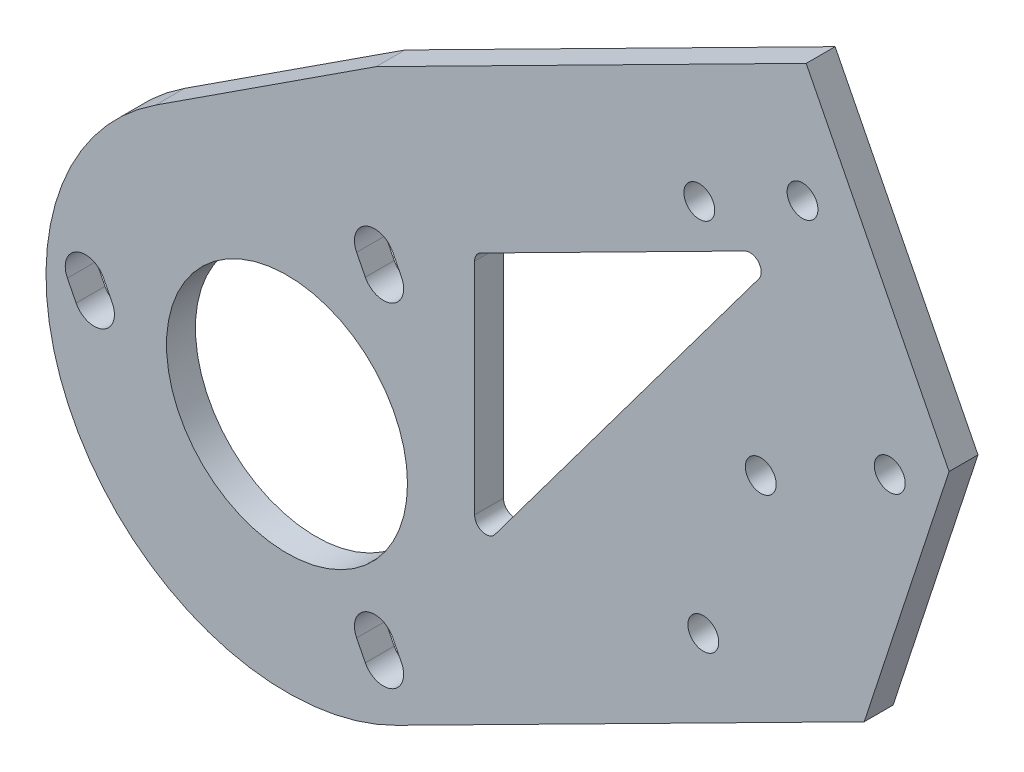
ISO-10303-21;
HEADER;
FILE_DESCRIPTION(('STEP AP214'),'2;1');
FILE_NAME('part.step','',(''),(''),'','','');
FILE_SCHEMA(('AUTOMOTIVE_DESIGN { 1 0 10303 214 1 1 1 1 }'));
ENDSEC;
DATA;
#1=APPLICATION_CONTEXT('core data for automotive mechanical design processes');
#2=APPLICATION_PROTOCOL_DEFINITION('international standard','automotive_design',2000,#1);
#3=PRODUCT_CONTEXT('',#1,'mechanical');
#4=PRODUCT('Part','Part','',(#3));
#5=PRODUCT_RELATED_PRODUCT_CATEGORY('part','',(#4));
#6=PRODUCT_DEFINITION_FORMATION('','',#4);
#7=PRODUCT_DEFINITION_CONTEXT('part definition',#1,'design');
#8=PRODUCT_DEFINITION('design','',#6,#7);
#9=PRODUCT_DEFINITION_SHAPE('','',#8);
#10=(LENGTH_UNIT() NAMED_UNIT(*) SI_UNIT(.MILLI.,.METRE.));
#11=(NAMED_UNIT(*) PLANE_ANGLE_UNIT() SI_UNIT($,.RADIAN.));
#12=(NAMED_UNIT(*) SI_UNIT($,.STERADIAN.) SOLID_ANGLE_UNIT());
#13=UNCERTAINTY_MEASURE_WITH_UNIT(LENGTH_MEASURE(1.E-05),#10,'distance_accuracy_value','');
#14=(GEOMETRIC_REPRESENTATION_CONTEXT(3) GLOBAL_UNCERTAINTY_ASSIGNED_CONTEXT((#13)) GLOBAL_UNIT_ASSIGNED_CONTEXT((#10,
#11,#12)) REPRESENTATION_CONTEXT('',''));
#15=CARTESIAN_POINT('',(0.,0.,0.));
#16=DIRECTION('',(0.,0.,1.));
#17=DIRECTION('',(1.,0.,0.));
#18=AXIS2_PLACEMENT_3D('',#15,#16,#17);
#19=CARTESIAN_POINT('',(-1.6306400674182E-13,-1.49186218934005E-12,3.));
#20=DIRECTION('',(0.,0.,1.));
#21=DIRECTION('',(1.,0.,0.));
#22=AXIS2_PLACEMENT_3D('',#19,#20,#21);
#23=PLANE('',#22);
#24=CARTESIAN_POINT('',(20.632958314391,0.684698738075619,3.));
#25=DIRECTION('',(0.,0.,1.));
#26=DIRECTION('',(-1.,0.,0.));
#27=AXIS2_PLACEMENT_3D('',#24,#25,#26);
#28=CIRCLE('',#27,1.17420210738263);
#29=CARTESIAN_POINT('',(19.4587562070083,0.684698738075619,3.));
#30=VERTEX_POINT('',#29);
#31=CARTESIAN_POINT('',(21.5737833891875,-0.0178671076754081,3.));
#32=VERTEX_POINT('',#31);
#33=EDGE_CURVE('E62',#30,#32,#28,.T.);
#34=ORIENTED_EDGE('',*,*,#33,.F.);
#35=DIRECTION('',(0.,-1.,0.));
#36=VECTOR('',#35,1.);
#37=CARTESIAN_POINT('',(19.4587562070083,0.684698738075619,3.));
#38=LINE('',#37,#36);
#39=CARTESIAN_POINT('',(19.4587562070083,23.484968490289,3.));
#40=VERTEX_POINT('',#39);
#41=EDGE_CURVE('E226',#40,#30,#38,.T.);
#42=ORIENTED_EDGE('',*,*,#41,.F.);
#43=CARTESIAN_POINT('',(20.632958314391,23.484968490289,3.));
#44=DIRECTION('',(0.,0.,1.));
#45=DIRECTION('',(1.,0.,0.));
#46=AXIS2_PLACEMENT_3D('',#43,#44,#45);
#47=CIRCLE('',#46,1.17420210738264);
#48=CARTESIAN_POINT('',(20.1023229816226,24.5324305338016,3.));
#49=VERTEX_POINT('',#48);
#50=EDGE_CURVE('E229',#49,#40,#47,.T.);
#51=ORIENTED_EDGE('',*,*,#50,.F.);
#52=DIRECTION('',(-0.892062820298879,-0.451911412381243,0.));
#53=VECTOR('',#52,1.);
#54=CARTESIAN_POINT('',(20.1023229816226,24.5324305338016,3.));
#55=LINE('',#54,#53);
#56=CARTESIAN_POINT('',(47.4888569635311,38.4062149471511,3.));
#57=VERTEX_POINT('',#56);
#58=EDGE_CURVE('E245',#57,#49,#55,.T.);
#59=ORIENTED_EDGE('',*,*,#58,.F.);
#60=CARTESIAN_POINT('',(48.0194922962994,37.3587529036385,3.));
#61=DIRECTION('',(0.,0.,1.));
#62=DIRECTION('',(-1.,0.,0.));
#63=AXIS2_PLACEMENT_3D('',#60,#61,#62);
#64=CIRCLE('',#63,1.17420210738263);
#65=CARTESIAN_POINT('',(48.9603173710959,36.6561870578874,3.));
#66=VERTEX_POINT('',#65);
#67=EDGE_CURVE('E242',#66,#57,#64,.T.);
#68=ORIENTED_EDGE('',*,*,#67,.F.);
#69=DIRECTION('',(0.598334683044547,0.8012462836519,0.));
#70=VECTOR('',#69,1.);
#71=CARTESIAN_POINT('',(48.9603173710959,36.6561870578874,3.));
#72=LINE('',#71,#70);
#73=EDGE_CURVE('E240',#32,#66,#72,.T.);
#74=ORIENTED_EDGE('',*,*,#73,.F.);
#75=EDGE_LOOP('',(#34,#42,#51,#59,#68,#74));
#76=FACE_BOUND('',#75,.T.);
#77=CARTESIAN_POINT('',(62.5262645189243,25.8460861556181,3.));
#78=DIRECTION('',(0.,0.,1.));
#79=DIRECTION('',(1.,0.,0.));
#80=AXIS2_PLACEMENT_3D('',#77,#78,#79);
#81=CIRCLE('',#80,1.59999999999979);
#82=CARTESIAN_POINT('',(64.1262645189241,25.8460861556181,3.));
#83=VERTEX_POINT('',#82);
#84=EDGE_CURVE('E264',#83,#83,#81,.T.);
#85=ORIENTED_EDGE('',*,*,#84,.F.);
#86=EDGE_LOOP('',(#85));
#87=FACE_BOUND('',#86,.T.);
#88=CARTESIAN_POINT('',(49.1453222144412,19.0674149698994,3.));
#89=DIRECTION('',(0.,0.,1.));
#90=DIRECTION('',(1.,0.,0.));
#91=AXIS2_PLACEMENT_3D('',#88,#89,#90);
#92=CIRCLE('',#91,1.59999999999967);
#93=CARTESIAN_POINT('',(50.7453222144408,19.0674149698994,3.));
#94=VERTEX_POINT('',#93);
#95=EDGE_CURVE('E270',#94,#94,#92,.T.);
#96=ORIENTED_EDGE('',*,*,#95,.F.);
#97=EDGE_LOOP('',(#96));
#98=FACE_BOUND('',#97,.T.);
#99=CARTESIAN_POINT('',(43.1880414885324,1.89930551405371,3.));
#100=DIRECTION('',(0.,0.,1.));
#101=DIRECTION('',(1.,0.,0.));
#102=AXIS2_PLACEMENT_3D('',#99,#100,#101);
#103=CIRCLE('',#102,1.6);
#104=CARTESIAN_POINT('',(44.7880414885324,1.89930551405371,3.));
#105=VERTEX_POINT('',#104);
#106=EDGE_CURVE('E252',#105,#105,#103,.T.);
#107=ORIENTED_EDGE('',*,*,#106,.F.);
#108=EDGE_LOOP('',(#107));
#109=FACE_BOUND('',#108,.T.);
#110=CARTESIAN_POINT('',(53.4762762668347,45.9233796145766,3.));
#111=DIRECTION('',(0.,0.,1.));
#112=DIRECTION('',(1.,0.,0.));
#113=AXIS2_PLACEMENT_3D('',#110,#111,#112);
#114=CIRCLE('',#113,1.60000000000032);
#115=CARTESIAN_POINT('',(55.076276266835,45.9233796145766,3.));
#116=VERTEX_POINT('',#115);
#117=EDGE_CURVE('E284',#116,#116,#114,.T.);
#118=ORIENTED_EDGE('',*,*,#117,.F.);
#119=EDGE_LOOP('',(#118));
#120=FACE_BOUND('',#119,.T.);
#121=DIRECTION('',(0.892062820298877,0.451911412381248,0.));
#122=VECTOR('',#121,1.);
#123=CARTESIAN_POINT('',(11.297785309531,-22.3015705074734,3.));
#124=LINE('',#123,#122);
#125=CARTESIAN_POINT('',(11.297785309531,-22.3015705074734,3.));
#126=VERTEX_POINT('',#125);
#127=CARTESIAN_POINT('',(59.8772938201872,2.30839395274492,3.));
#128=VERTEX_POINT('',#127);
#129=EDGE_CURVE('E397',#126,#128,#124,.T.);
#130=ORIENTED_EDGE('',*,*,#129,.T.);
#131=DIRECTION('',(-0.311234045287363,-0.950333293668102,0.));
#132=VECTOR('',#131,1.);
#133=CARTESIAN_POINT('',(53.3944143939385,-17.4866646241909,3.));
#134=LINE('',#133,#132);
#135=CARTESIAN_POINT('',(68.6803219785398,29.1878786063474,3.));
#136=VERTEX_POINT('',#135);
#137=EDGE_CURVE('E13',#128,#136,#134,.F.);
#138=ORIENTED_EDGE('',*,*,#137,.T.);
#139=DIRECTION('',(-0.451911412381248,0.892062820298876,0.));
#140=VECTOR('',#139,1.);
#141=CARTESIAN_POINT('',(77.7185502261648,11.3466222003699,3.));
#142=LINE('',#141,#140);
#143=CARTESIAN_POINT('',(53.8576276524343,58.4475391121517,3.));
#144=VERTEX_POINT('',#143);
#145=EDGE_CURVE('E400',#136,#144,#142,.T.);
#146=ORIENTED_EDGE('',*,*,#145,.T.);
#147=DIRECTION('',(-0.892062820298879,-0.451911412381243,0.));
#148=VECTOR('',#147,1.);
#149=CARTESIAN_POINT('',(53.8576276524343,58.4475391121517,3.));
#150=LINE('',#149,#148);
#151=CARTESIAN_POINT('',(9.25448663749034,35.8519684930896,3.));
#152=VERTEX_POINT('',#151);
#153=EDGE_CURVE('E389',#144,#152,#150,.T.);
#154=ORIENTED_EDGE('',*,*,#153,.T.);
#155=DIRECTION('',(-0.838118804228008,-0.545487735883597,0.));
#156=VECTOR('',#155,1.);
#157=CARTESIAN_POINT('',(-13.6371933970901,20.9529701056987,3.));
#158=LINE('',#157,#156);
#159=CARTESIAN_POINT('',(-13.6371933970901,20.9529701056987,3.));
#160=VERTEX_POINT('',#159);
#161=EDGE_CURVE('E392',#152,#160,#158,.T.);
#162=ORIENTED_EDGE('',*,*,#161,.T.);
#163=CARTESIAN_POINT('',(-1.6306400674182E-13,-1.49186218934005E-12,3.));
#164=DIRECTION('',(0.,0.,1.));
#165=DIRECTION('',(1.,0.,0.));
#166=AXIS2_PLACEMENT_3D('',#163,#164,#165);
#167=CIRCLE('',#166,25.);
#168=EDGE_CURVE('E395',#160,#126,#167,.T.);
#169=ORIENTED_EDGE('',*,*,#168,.T.);
#170=EDGE_LOOP('',(#130,#138,#146,#154,#162,#169));
#171=FACE_BOUND('',#170,.T.);
#172=CARTESIAN_POINT('',(-1.6306400674182E-13,-1.49186218934005E-12,3.));
#173=DIRECTION('',(0.,0.,1.));
#174=DIRECTION('',(1.,0.,0.));
#175=AXIS2_PLACEMENT_3D('',#172,#173,#174);
#176=CIRCLE('',#175,12.5);
#177=CARTESIAN_POINT('',(12.4999999999998,-1.49186218934005E-12,3.));
#178=VERTEX_POINT('',#177);
#179=EDGE_CURVE('E383',#178,#178,#176,.T.);
#180=ORIENTED_EDGE('',*,*,#179,.F.);
#181=EDGE_LOOP('',(#180));
#182=FACE_BOUND('',#181,.T.);
#183=DIRECTION('',(-0.451911412381246,0.892062820298877,0.));
#184=VECTOR('',#183,1.);
#185=CARTESIAN_POINT('',(11.8733319226275,18.2695220416649,3.));
#186=LINE('',#185,#184);
#187=CARTESIAN_POINT('',(11.8733319226275,18.2695220416649,3.));
#188=VERTEX_POINT('',#187);
#189=CARTESIAN_POINT('',(10.969509097865,20.0536476822627,3.));
#190=VERTEX_POINT('',#189);
#191=EDGE_CURVE('E354',#188,#190,#186,.T.);
#192=ORIENTED_EDGE('',*,*,#191,.F.);
#193=CARTESIAN_POINT('',(9.99999999999988,17.3205080756643,3.));
#194=DIRECTION('',(0.,0.,1.));
#195=DIRECTION('',(1.,0.,0.));
#196=AXIS2_PLACEMENT_3D('',#193,#194,#195);
#197=CIRCLE('',#196,2.1);
#198=CARTESIAN_POINT('',(8.12666807737224,16.3714941096637,3.));
#199=VERTEX_POINT('',#198);
#200=EDGE_CURVE('E352',#199,#188,#197,.T.);
#201=ORIENTED_EDGE('',*,*,#200,.F.);
#202=DIRECTION('',(0.451911412381248,-0.892062820298877,0.));
#203=VECTOR('',#202,1.);
#204=CARTESIAN_POINT('',(8.12666807737224,16.3714941096637,3.));
#205=LINE('',#204,#203);
#206=CARTESIAN_POINT('',(7.22284525260974,18.1556197502614,3.));
#207=VERTEX_POINT('',#206);
#208=EDGE_CURVE('E360',#207,#199,#205,.T.);
#209=ORIENTED_EDGE('',*,*,#208,.F.);
#210=CARTESIAN_POINT('',(9.09617717523739,19.1046337162621,3.));
#211=DIRECTION('',(0.,0.,1.));
#212=DIRECTION('',(1.,0.,0.));
#213=AXIS2_PLACEMENT_3D('',#210,#211,#212);
#214=CIRCLE('',#213,2.1);
#215=EDGE_CURVE('E357',#190,#207,#214,.T.);
#216=ORIENTED_EDGE('',*,*,#215,.F.);
#217=EDGE_LOOP('',(#192,#201,#209,#216));
#218=FACE_BOUND('',#217,.T.);
#219=DIRECTION('',(-0.451911412381243,0.892062820298879,0.));
#220=VECTOR('',#219,1.);
#221=CARTESIAN_POINT('',(-18.1266680773724,0.949013965976172,3.));
#222=LINE('',#221,#220);
#223=CARTESIAN_POINT('',(-18.1266680773724,0.949013965976172,3.));
#224=VERTEX_POINT('',#223);
#225=CARTESIAN_POINT('',(-19.0304909021349,2.73313960657392,3.));
#226=VERTEX_POINT('',#225);
#227=EDGE_CURVE('E323',#224,#226,#222,.T.);
#228=ORIENTED_EDGE('',*,*,#227,.F.);
#229=CARTESIAN_POINT('',(-20.,-2.44396516912992E-11,3.));
#230=DIRECTION('',(0.,0.,1.));
#231=DIRECTION('',(1.,0.,0.));
#232=AXIS2_PLACEMENT_3D('',#229,#230,#231);
#233=CIRCLE('',#232,2.1);
#234=CARTESIAN_POINT('',(-21.8733319226276,-0.949013966025059,3.));
#235=VERTEX_POINT('',#234);
#236=EDGE_CURVE('E321',#235,#224,#233,.T.);
#237=ORIENTED_EDGE('',*,*,#236,.F.);
#238=DIRECTION('',(0.451911412381248,-0.892062820298876,0.));
#239=VECTOR('',#238,1.);
#240=CARTESIAN_POINT('',(-21.8733319226276,-0.949013966025059,3.));
#241=LINE('',#240,#239);
#242=CARTESIAN_POINT('',(-22.7771547473901,0.835111674572692,3.));
#243=VERTEX_POINT('',#242);
#244=EDGE_CURVE('E329',#243,#235,#241,.T.);
#245=ORIENTED_EDGE('',*,*,#244,.F.);
#246=CARTESIAN_POINT('',(-20.9038228247625,1.78412564057331,3.));
#247=DIRECTION('',(0.,0.,1.));
#248=DIRECTION('',(1.,0.,0.));
#249=AXIS2_PLACEMENT_3D('',#246,#247,#248);
#250=CIRCLE('',#249,2.1);
#251=EDGE_CURVE('E326',#226,#243,#250,.T.);
#252=ORIENTED_EDGE('',*,*,#251,.F.);
#253=EDGE_LOOP('',(#228,#237,#245,#252));
#254=FACE_BOUND('',#253,.T.);
#255=DIRECTION('',(-0.451911412381243,0.892062820298879,0.));
#256=VECTOR('',#255,1.);
#257=CARTESIAN_POINT('',(11.8733319226276,-16.3714941097127,3.));
#258=LINE('',#257,#256);
#259=CARTESIAN_POINT('',(11.8733319226276,-16.3714941097127,3.));
#260=VERTEX_POINT('',#259);
#261=CARTESIAN_POINT('',(10.9695090978652,-14.5873684691149,3.));
#262=VERTEX_POINT('',#261);
#263=EDGE_CURVE('E292',#260,#262,#258,.T.);
#264=ORIENTED_EDGE('',*,*,#263,.F.);
#265=CARTESIAN_POINT('',(9.99999999999999,-17.3205080757133,3.));
#266=DIRECTION('',(0.,0.,1.));
#267=DIRECTION('',(1.,0.,0.));
#268=AXIS2_PLACEMENT_3D('',#265,#266,#267);
#269=CIRCLE('',#268,2.1);
#270=CARTESIAN_POINT('',(8.12666807737235,-18.2695220417139,3.));
#271=VERTEX_POINT('',#270);
#272=EDGE_CURVE('E290',#271,#260,#269,.T.);
#273=ORIENTED_EDGE('',*,*,#272,.F.);
#274=DIRECTION('',(0.451911412381249,-0.892062820298876,0.));
#275=VECTOR('',#274,1.);
#276=CARTESIAN_POINT('',(8.12666807737235,-18.2695220417139,3.));
#277=LINE('',#276,#275);
#278=CARTESIAN_POINT('',(7.22284525260986,-16.4853964011162,3.));
#279=VERTEX_POINT('',#278);
#280=EDGE_CURVE('E298',#279,#271,#277,.T.);
#281=ORIENTED_EDGE('',*,*,#280,.F.);
#282=CARTESIAN_POINT('',(9.0961771752375,-15.5363824351155,3.));
#283=DIRECTION('',(0.,0.,1.));
#284=DIRECTION('',(1.,0.,0.));
#285=AXIS2_PLACEMENT_3D('',#282,#283,#284);
#286=CIRCLE('',#285,2.10000000000001);
#287=EDGE_CURVE('E295',#262,#279,#286,.T.);
#288=ORIENTED_EDGE('',*,*,#287,.F.);
#289=EDGE_LOOP('',(#264,#273,#281,#288));
#290=FACE_BOUND('',#289,.T.);
#291=CARTESIAN_POINT('',(42.7715224232482,40.5004426660017,3.));
#292=DIRECTION('',(0.,0.,1.));
#293=DIRECTION('',(1.,0.,0.));
#294=AXIS2_PLACEMENT_3D('',#291,#292,#293);
#295=CIRCLE('',#294,1.60000000000021);
#296=CARTESIAN_POINT('',(44.3715224232484,40.5004426660017,3.));
#297=VERTEX_POINT('',#296);
#298=EDGE_CURVE('E278',#297,#297,#295,.T.);
#299=ORIENTED_EDGE('',*,*,#298,.F.);
#300=EDGE_LOOP('',(#299));
#301=FACE_BOUND('',#300,.T.);
#302=ADVANCED_FACE('F47',(#76,#87,#98,#109,#120,#171,#182,#218,#254,#290,#301),#23,.T.);
#303=CARTESIAN_POINT('',(-1.6306400674182E-13,-1.49186218934005E-12,0.));
#304=DIRECTION('',(0.,0.,1.));
#305=DIRECTION('',(1.,0.,0.));
#306=AXIS2_PLACEMENT_3D('',#303,#304,#305);
#307=PLANE('',#306);
#308=DIRECTION('',(0.,-1.,0.));
#309=VECTOR('',#308,1.);
#310=CARTESIAN_POINT('',(19.4587562070083,0.684698738075619,0.));
#311=LINE('',#310,#309);
#312=CARTESIAN_POINT('',(19.4587562070083,23.484968490289,0.));
#313=VERTEX_POINT('',#312);
#314=CARTESIAN_POINT('',(19.4587562070083,0.684698738075619,0.));
#315=VERTEX_POINT('',#314);
#316=EDGE_CURVE('E215',#313,#315,#311,.T.);
#317=ORIENTED_EDGE('',*,*,#316,.T.);
#318=CARTESIAN_POINT('',(20.632958314391,0.684698738075619,0.));
#319=DIRECTION('',(0.,0.,1.));
#320=DIRECTION('',(-1.,0.,0.));
#321=AXIS2_PLACEMENT_3D('',#318,#319,#320);
#322=CIRCLE('',#321,1.17420210738263);
#323=CARTESIAN_POINT('',(21.5737833891875,-0.0178671076754102,0.));
#324=VERTEX_POINT('',#323);
#325=EDGE_CURVE('E209',#315,#324,#322,.T.);
#326=ORIENTED_EDGE('',*,*,#325,.T.);
#327=DIRECTION('',(0.598334683044547,0.8012462836519,0.));
#328=VECTOR('',#327,1.);
#329=CARTESIAN_POINT('',(48.9603173710959,36.6561870578874,0.));
#330=LINE('',#329,#328);
#331=CARTESIAN_POINT('',(48.9603173710959,36.6561870578874,0.));
#332=VERTEX_POINT('',#331);
#333=EDGE_CURVE('E218',#324,#332,#330,.T.);
#334=ORIENTED_EDGE('',*,*,#333,.T.);
#335=CARTESIAN_POINT('',(48.0194922962994,37.3587529036385,0.));
#336=DIRECTION('',(0.,0.,1.));
#337=DIRECTION('',(-1.,0.,0.));
#338=AXIS2_PLACEMENT_3D('',#335,#336,#337);
#339=CIRCLE('',#338,1.17420210738263);
#340=CARTESIAN_POINT('',(47.4888569635311,38.4062149471511,0.));
#341=VERTEX_POINT('',#340);
#342=EDGE_CURVE('E70',#332,#341,#339,.T.);
#343=ORIENTED_EDGE('',*,*,#342,.T.);
#344=DIRECTION('',(-0.892062820298879,-0.451911412381243,0.));
#345=VECTOR('',#344,1.);
#346=CARTESIAN_POINT('',(20.1023229816226,24.5324305338016,0.));
#347=LINE('',#346,#345);
#348=CARTESIAN_POINT('',(20.1023229816226,24.5324305338016,0.));
#349=VERTEX_POINT('',#348);
#350=EDGE_CURVE('E233',#341,#349,#347,.T.);
#351=ORIENTED_EDGE('',*,*,#350,.T.);
#352=CARTESIAN_POINT('',(20.632958314391,23.484968490289,0.));
#353=DIRECTION('',(0.,0.,1.));
#354=DIRECTION('',(1.,0.,0.));
#355=AXIS2_PLACEMENT_3D('',#352,#353,#354);
#356=CIRCLE('',#355,1.17420210738264);
#357=EDGE_CURVE('E236',#349,#313,#356,.T.);
#358=ORIENTED_EDGE('',*,*,#357,.T.);
#359=EDGE_LOOP('',(#317,#326,#334,#343,#351,#358));
#360=FACE_BOUND('',#359,.T.);
#361=CARTESIAN_POINT('',(62.5262645189243,25.8460861556181,0.));
#362=DIRECTION('',(0.,0.,1.));
#363=DIRECTION('',(1.,0.,0.));
#364=AXIS2_PLACEMENT_3D('',#361,#362,#363);
#365=CIRCLE('',#364,1.59999999999979);
#366=CARTESIAN_POINT('',(64.1262645189241,25.8460861556181,0.));
#367=VERTEX_POINT('',#366);
#368=EDGE_CURVE('E260',#367,#367,#365,.T.);
#369=ORIENTED_EDGE('',*,*,#368,.T.);
#370=EDGE_LOOP('',(#369));
#371=FACE_BOUND('',#370,.T.);
#372=CARTESIAN_POINT('',(49.1453222144412,19.0674149698994,0.));
#373=DIRECTION('',(0.,0.,1.));
#374=DIRECTION('',(1.,0.,0.));
#375=AXIS2_PLACEMENT_3D('',#372,#373,#374);
#376=CIRCLE('',#375,1.59999999999967);
#377=CARTESIAN_POINT('',(50.7453222144408,19.0674149698994,0.));
#378=VERTEX_POINT('',#377);
#379=EDGE_CURVE('E267',#378,#378,#376,.T.);
#380=ORIENTED_EDGE('',*,*,#379,.T.);
#381=EDGE_LOOP('',(#380));
#382=FACE_BOUND('',#381,.T.);
#383=CARTESIAN_POINT('',(43.1880414885324,1.89930551405371,0.));
#384=DIRECTION('',(0.,0.,1.));
#385=DIRECTION('',(1.,0.,0.));
#386=AXIS2_PLACEMENT_3D('',#383,#384,#385);
#387=CIRCLE('',#386,1.6);
#388=CARTESIAN_POINT('',(44.7880414885324,1.89930551405371,0.));
#389=VERTEX_POINT('',#388);
#390=EDGE_CURVE('E273',#389,#389,#387,.T.);
#391=ORIENTED_EDGE('',*,*,#390,.T.);
#392=EDGE_LOOP('',(#391));
#393=FACE_BOUND('',#392,.T.);
#394=CARTESIAN_POINT('',(-20.,-2.44396516912992E-11,0.));
#395=DIRECTION('',(0.,0.,1.));
#396=DIRECTION('',(1.,0.,0.));
#397=AXIS2_PLACEMENT_3D('',#394,#395,#396);
#398=CIRCLE('',#397,2.1);
#399=CARTESIAN_POINT('',(-21.8733319226276,-0.949013966025059,0.));
#400=VERTEX_POINT('',#399);
#401=CARTESIAN_POINT('',(-18.1266680773724,0.949013965976172,0.));
#402=VERTEX_POINT('',#401);
#403=EDGE_CURVE('E320',#400,#402,#398,.T.);
#404=ORIENTED_EDGE('',*,*,#403,.T.);
#405=DIRECTION('',(-0.451911412381243,0.892062820298879,0.));
#406=VECTOR('',#405,1.);
#407=CARTESIAN_POINT('',(-18.1266680773724,0.949013965976172,0.));
#408=LINE('',#407,#406);
#409=CARTESIAN_POINT('',(-19.0304909021349,2.73313960657392,0.));
#410=VERTEX_POINT('',#409);
#411=EDGE_CURVE('E334',#402,#410,#408,.T.);
#412=ORIENTED_EDGE('',*,*,#411,.T.);
#413=CARTESIAN_POINT('',(-20.9038228247625,1.78412564057331,0.));
#414=DIRECTION('',(0.,0.,1.));
#415=DIRECTION('',(1.,0.,0.));
#416=AXIS2_PLACEMENT_3D('',#413,#414,#415);
#417=CIRCLE('',#416,2.1);
#418=CARTESIAN_POINT('',(-22.7771547473901,0.835111674572693,0.));
#419=VERTEX_POINT('',#418);
#420=EDGE_CURVE('E337',#410,#419,#417,.T.);
#421=ORIENTED_EDGE('',*,*,#420,.T.);
#422=DIRECTION('',(0.451911412381248,-0.892062820298876,0.));
#423=VECTOR('',#422,1.);
#424=CARTESIAN_POINT('',(-21.8733319226276,-0.949013966025059,0.));
#425=LINE('',#424,#423);
#426=EDGE_CURVE('E324',#419,#400,#425,.T.);
#427=ORIENTED_EDGE('',*,*,#426,.T.);
#428=EDGE_LOOP('',(#404,#412,#421,#427));
#429=FACE_BOUND('',#428,.T.);
#430=CARTESIAN_POINT('',(-1.6306400674182E-13,-1.49186218934005E-12,0.));
#431=DIRECTION('',(0.,0.,1.));
#432=DIRECTION('',(1.,0.,0.));
#433=AXIS2_PLACEMENT_3D('',#430,#431,#432);
#434=CIRCLE('',#433,12.5);
#435=CARTESIAN_POINT('',(12.4999999999998,-1.49186218934005E-12,0.));
#436=VERTEX_POINT('',#435);
#437=EDGE_CURVE('E382',#436,#436,#434,.T.);
#438=ORIENTED_EDGE('',*,*,#437,.T.);
#439=EDGE_LOOP('',(#438));
#440=FACE_BOUND('',#439,.T.);
#441=DIRECTION('',(-0.451911412381248,0.892062820298876,0.));
#442=VECTOR('',#441,1.);
#443=CARTESIAN_POINT('',(77.7185502261648,11.3466222003699,0.));
#444=LINE('',#443,#442);
#445=CARTESIAN_POINT('',(68.6803219785398,29.1878786063474,0.));
#446=VERTEX_POINT('',#445);
#447=CARTESIAN_POINT('',(53.8576276524343,58.4475391121517,0.));
#448=VERTEX_POINT('',#447);
#449=EDGE_CURVE('E393',#446,#448,#444,.T.);
#450=ORIENTED_EDGE('',*,*,#449,.F.);
#451=DIRECTION('',(0.311234045287363,0.950333293668102,0.));
#452=VECTOR('',#451,1.);
#453=CARTESIAN_POINT('',(68.6803219785398,29.1878786063474,0.));
#454=LINE('',#453,#452);
#455=CARTESIAN_POINT('',(59.8772938201872,2.30839395274492,0.));
#456=VERTEX_POINT('',#455);
#457=EDGE_CURVE('E427',#446,#456,#454,.F.);
#458=ORIENTED_EDGE('',*,*,#457,.T.);
#459=DIRECTION('',(0.892062820298877,0.451911412381248,0.));
#460=VECTOR('',#459,1.);
#461=CARTESIAN_POINT('',(11.297785309531,-22.3015705074734,0.));
#462=LINE('',#461,#460);
#463=CARTESIAN_POINT('',(11.297785309531,-22.3015705074734,0.));
#464=VERTEX_POINT('',#463);
#465=EDGE_CURVE('E409',#464,#456,#462,.T.);
#466=ORIENTED_EDGE('',*,*,#465,.F.);
#467=CARTESIAN_POINT('',(-1.6306400674182E-13,-1.49186218934005E-12,0.));
#468=DIRECTION('',(0.,0.,1.));
#469=DIRECTION('',(1.,0.,0.));
#470=AXIS2_PLACEMENT_3D('',#467,#468,#469);
#471=CIRCLE('',#470,25.);
#472=CARTESIAN_POINT('',(-13.6371933970901,20.9529701056987,0.));
#473=VERTEX_POINT('',#472);
#474=EDGE_CURVE('E407',#473,#464,#471,.T.);
#475=ORIENTED_EDGE('',*,*,#474,.F.);
#476=DIRECTION('',(-0.838118804228008,-0.545487735883597,0.));
#477=VECTOR('',#476,1.);
#478=CARTESIAN_POINT('',(-13.6371933970901,20.9529701056987,0.));
#479=LINE('',#478,#477);
#480=CARTESIAN_POINT('',(9.25448663749034,35.8519684930896,0.));
#481=VERTEX_POINT('',#480);
#482=EDGE_CURVE('E405',#481,#473,#479,.T.);
#483=ORIENTED_EDGE('',*,*,#482,.F.);
#484=DIRECTION('',(-0.892062820298879,-0.451911412381243,0.));
#485=VECTOR('',#484,1.);
#486=CARTESIAN_POINT('',(53.8576276524343,58.4475391121517,0.));
#487=LINE('',#486,#485);
#488=EDGE_CURVE('E386',#448,#481,#487,.T.);
#489=ORIENTED_EDGE('',*,*,#488,.F.);
#490=EDGE_LOOP('',(#450,#458,#466,#475,#483,#489));
#491=FACE_BOUND('',#490,.T.);
#492=CARTESIAN_POINT('',(9.99999999999988,17.3205080756643,0.));
#493=DIRECTION('',(0.,0.,1.));
#494=DIRECTION('',(1.,0.,0.));
#495=AXIS2_PLACEMENT_3D('',#492,#493,#494);
#496=CIRCLE('',#495,2.1);
#497=CARTESIAN_POINT('',(8.12666807737224,16.3714941096637,0.));
#498=VERTEX_POINT('',#497);
#499=CARTESIAN_POINT('',(11.8733319226275,18.2695220416649,0.));
#500=VERTEX_POINT('',#499);
#501=EDGE_CURVE('E351',#498,#500,#496,.T.);
#502=ORIENTED_EDGE('',*,*,#501,.T.);
#503=DIRECTION('',(-0.451911412381246,0.892062820298877,0.));
#504=VECTOR('',#503,1.);
#505=CARTESIAN_POINT('',(11.8733319226275,18.2695220416649,0.));
#506=LINE('',#505,#504);
#507=CARTESIAN_POINT('',(10.969509097865,20.0536476822627,0.));
#508=VERTEX_POINT('',#507);
#509=EDGE_CURVE('E365',#500,#508,#506,.T.);
#510=ORIENTED_EDGE('',*,*,#509,.T.);
#511=CARTESIAN_POINT('',(9.09617717523739,19.1046337162621,0.));
#512=DIRECTION('',(0.,0.,1.));
#513=DIRECTION('',(1.,0.,0.));
#514=AXIS2_PLACEMENT_3D('',#511,#512,#513);
#515=CIRCLE('',#514,2.1);
#516=CARTESIAN_POINT('',(7.22284525260974,18.1556197502614,0.));
#517=VERTEX_POINT('',#516);
#518=EDGE_CURVE('E368',#508,#517,#515,.T.);
#519=ORIENTED_EDGE('',*,*,#518,.T.);
#520=DIRECTION('',(0.451911412381248,-0.892062820298877,0.));
#521=VECTOR('',#520,1.);
#522=CARTESIAN_POINT('',(8.12666807737224,16.3714941096637,0.));
#523=LINE('',#522,#521);
#524=EDGE_CURVE('E355',#517,#498,#523,.T.);
#525=ORIENTED_EDGE('',*,*,#524,.T.);
#526=EDGE_LOOP('',(#502,#510,#519,#525));
#527=FACE_BOUND('',#526,.T.);
#528=CARTESIAN_POINT('',(9.99999999999999,-17.3205080757133,0.));
#529=DIRECTION('',(0.,0.,1.));
#530=DIRECTION('',(1.,0.,0.));
#531=AXIS2_PLACEMENT_3D('',#528,#529,#530);
#532=CIRCLE('',#531,2.1);
#533=CARTESIAN_POINT('',(8.12666807737235,-18.2695220417139,0.));
#534=VERTEX_POINT('',#533);
#535=CARTESIAN_POINT('',(11.8733319226276,-16.3714941097127,0.));
#536=VERTEX_POINT('',#535);
#537=EDGE_CURVE('E287',#534,#536,#532,.T.);
#538=ORIENTED_EDGE('',*,*,#537,.T.);
#539=DIRECTION('',(-0.451911412381243,0.892062820298879,0.));
#540=VECTOR('',#539,1.);
#541=CARTESIAN_POINT('',(11.8733319226276,-16.3714941097127,0.));
#542=LINE('',#541,#540);
#543=CARTESIAN_POINT('',(10.9695090978652,-14.5873684691149,0.));
#544=VERTEX_POINT('',#543);
#545=EDGE_CURVE('E303',#536,#544,#542,.T.);
#546=ORIENTED_EDGE('',*,*,#545,.T.);
#547=CARTESIAN_POINT('',(9.0961771752375,-15.5363824351155,0.));
#548=DIRECTION('',(0.,0.,1.));
#549=DIRECTION('',(1.,0.,0.));
#550=AXIS2_PLACEMENT_3D('',#547,#548,#549);
#551=CIRCLE('',#550,2.10000000000001);
#552=CARTESIAN_POINT('',(7.22284525260986,-16.4853964011162,0.));
#553=VERTEX_POINT('',#552);
#554=EDGE_CURVE('E306',#544,#553,#551,.T.);
#555=ORIENTED_EDGE('',*,*,#554,.T.);
#556=DIRECTION('',(0.451911412381249,-0.892062820298876,0.));
#557=VECTOR('',#556,1.);
#558=CARTESIAN_POINT('',(8.12666807737235,-18.2695220417139,0.));
#559=LINE('',#558,#557);
#560=EDGE_CURVE('E293',#553,#534,#559,.T.);
#561=ORIENTED_EDGE('',*,*,#560,.T.);
#562=EDGE_LOOP('',(#538,#546,#555,#561));
#563=FACE_BOUND('',#562,.T.);
#564=CARTESIAN_POINT('',(53.4762762668347,45.9233796145766,0.));
#565=DIRECTION('',(0.,0.,1.));
#566=DIRECTION('',(1.,0.,0.));
#567=AXIS2_PLACEMENT_3D('',#564,#565,#566);
#568=CIRCLE('',#567,1.60000000000032);
#569=CARTESIAN_POINT('',(55.076276266835,45.9233796145766,0.));
#570=VERTEX_POINT('',#569);
#571=EDGE_CURVE('E281',#570,#570,#568,.T.);
#572=ORIENTED_EDGE('',*,*,#571,.T.);
#573=EDGE_LOOP('',(#572));
#574=FACE_BOUND('',#573,.T.);
#575=CARTESIAN_POINT('',(42.7715224232482,40.5004426660017,0.));
#576=DIRECTION('',(0.,0.,1.));
#577=DIRECTION('',(1.,0.,0.));
#578=AXIS2_PLACEMENT_3D('',#575,#576,#577);
#579=CIRCLE('',#578,1.60000000000021);
#580=CARTESIAN_POINT('',(44.3715224232484,40.5004426660017,0.));
#581=VERTEX_POINT('',#580);
#582=EDGE_CURVE('E263',#581,#581,#579,.T.);
#583=ORIENTED_EDGE('',*,*,#582,.T.);
#584=EDGE_LOOP('',(#583));
#585=FACE_BOUND('',#584,.T.);
#586=ADVANCED_FACE('F222',(#360,#371,#382,#393,#429,#440,#491,#527,#563,#574,#585),#307,.F.);
#587=CARTESIAN_POINT('',(53.8576276524343,58.4475391121517,3.));
#588=DIRECTION('',(0.451911412381243,-0.892062820298879,0.));
#589=DIRECTION('',(0.892062820298879,0.451911412381243,0.));
#590=AXIS2_PLACEMENT_3D('',#587,#588,#589);
#591=PLANE('',#590);
#592=ORIENTED_EDGE('',*,*,#488,.T.);
#593=DIRECTION('',(0.,0.,-1.));
#594=VECTOR('',#593,1.);
#595=CARTESIAN_POINT('',(9.25448663749034,35.8519684930896,3.));
#596=LINE('',#595,#594);
#597=EDGE_CURVE('E421',#152,#481,#596,.T.);
#598=ORIENTED_EDGE('',*,*,#597,.F.);
#599=ORIENTED_EDGE('',*,*,#153,.F.);
#600=DIRECTION('',(0.,0.,-1.));
#601=VECTOR('',#600,1.);
#602=CARTESIAN_POINT('',(53.8576276524343,58.4475391121517,3.));
#603=LINE('',#602,#601);
#604=EDGE_CURVE('E402',#144,#448,#603,.T.);
#605=ORIENTED_EDGE('',*,*,#604,.T.);
#606=EDGE_LOOP('',(#592,#598,#599,#605));
#607=FACE_BOUND('',#606,.T.);
#608=ADVANCED_FACE('F451',(#607),#591,.F.);
#609=CARTESIAN_POINT('',(-13.6371933970901,20.9529701056987,3.));
#610=DIRECTION('',(0.545487735883597,-0.838118804228008,0.));
#611=DIRECTION('',(0.838118804228009,0.545487735883597,0.));
#612=AXIS2_PLACEMENT_3D('',#609,#610,#611);
#613=PLANE('',#612);
#614=ORIENTED_EDGE('',*,*,#482,.T.);
#615=DIRECTION('',(0.,0.,-1.));
#616=VECTOR('',#615,1.);
#617=CARTESIAN_POINT('',(-13.6371933970901,20.9529701056987,3.));
#618=LINE('',#617,#616);
#619=EDGE_CURVE('E418',#160,#473,#618,.T.);
#620=ORIENTED_EDGE('',*,*,#619,.F.);
#621=ORIENTED_EDGE('',*,*,#161,.F.);
#622=ORIENTED_EDGE('',*,*,#597,.T.);
#623=EDGE_LOOP('',(#614,#620,#621,#622));
#624=FACE_BOUND('',#623,.T.);
#625=ADVANCED_FACE('F455',(#624),#613,.F.);
#626=CARTESIAN_POINT('',(-1.6306400674182E-13,-1.49186218934005E-12,3.));
#627=DIRECTION('',(0.,0.,-1.));
#628=DIRECTION('',(-1.,0.,0.));
#629=AXIS2_PLACEMENT_3D('',#626,#627,#628);
#630=CYLINDRICAL_SURFACE('',#629,25.);
#631=ORIENTED_EDGE('',*,*,#474,.T.);
#632=DIRECTION('',(0.,0.,-1.));
#633=VECTOR('',#632,1.);
#634=CARTESIAN_POINT('',(11.297785309531,-22.3015705074734,3.));
#635=LINE('',#634,#633);
#636=EDGE_CURVE('E415',#126,#464,#635,.T.);
#637=ORIENTED_EDGE('',*,*,#636,.F.);
#638=ORIENTED_EDGE('',*,*,#168,.F.);
#639=ORIENTED_EDGE('',*,*,#619,.T.);
#640=EDGE_LOOP('',(#631,#637,#638,#639));
#641=FACE_BOUND('',#640,.T.);
#642=ADVANCED_FACE('F457',(#641),#630,.T.);
#643=CARTESIAN_POINT('',(11.297785309531,-22.3015705074734,3.));
#644=DIRECTION('',(-0.451911412381248,0.892062820298876,0.));
#645=DIRECTION('',(-0.892062820298877,-0.451911412381248,0.));
#646=AXIS2_PLACEMENT_3D('',#643,#644,#645);
#647=PLANE('',#646);
#648=ORIENTED_EDGE('',*,*,#465,.T.);
#649=DIRECTION('',(0.,0.,1.));
#650=VECTOR('',#649,1.);
#651=CARTESIAN_POINT('',(59.8772938201872,2.30839395274492,3.));
#652=LINE('',#651,#650);
#653=EDGE_CURVE('E55',#456,#128,#652,.T.);
#654=ORIENTED_EDGE('',*,*,#653,.T.);
#655=ORIENTED_EDGE('',*,*,#129,.F.);
#656=ORIENTED_EDGE('',*,*,#636,.T.);
#657=EDGE_LOOP('',(#648,#654,#655,#656));
#658=FACE_BOUND('',#657,.T.);
#659=ADVANCED_FACE('F431',(#658),#647,.F.);
#660=CARTESIAN_POINT('',(77.7185502261648,11.3466222003699,3.));
#661=DIRECTION('',(-0.892062820298876,-0.451911412381248,0.));
#662=DIRECTION('',(0.451911412381248,-0.892062820298877,0.));
#663=AXIS2_PLACEMENT_3D('',#660,#661,#662);
#664=PLANE('',#663);
#665=ORIENTED_EDGE('',*,*,#145,.F.);
#666=DIRECTION('',(0.,0.,-1.));
#667=VECTOR('',#666,1.);
#668=CARTESIAN_POINT('',(68.6803219785398,29.1878786063474,3.));
#669=LINE('',#668,#667);
#670=EDGE_CURVE('E424',#136,#446,#669,.T.);
#671=ORIENTED_EDGE('',*,*,#670,.T.);
#672=ORIENTED_EDGE('',*,*,#449,.T.);
#673=ORIENTED_EDGE('',*,*,#604,.F.);
#674=EDGE_LOOP('',(#665,#671,#672,#673));
#675=FACE_BOUND('',#674,.T.);
#676=ADVANCED_FACE('F443',(#675),#664,.F.);
#677=CARTESIAN_POINT('',(-1.6306400674182E-13,-1.49186218934005E-12,3.));
#678=DIRECTION('',(0.,0.,-1.));
#679=DIRECTION('',(-1.,0.,0.));
#680=AXIS2_PLACEMENT_3D('',#677,#678,#679);
#681=CYLINDRICAL_SURFACE('',#680,12.5);
#682=ORIENTED_EDGE('',*,*,#179,.T.);
#683=EDGE_LOOP('',(#682));
#684=FACE_BOUND('',#683,.T.);
#685=ORIENTED_EDGE('',*,*,#437,.F.);
#686=EDGE_LOOP('',(#685));
#687=FACE_BOUND('',#686,.T.);
#688=ADVANCED_FACE('F475',(#684,#687),#681,.F.);
#689=CARTESIAN_POINT('',(9.99999999999988,17.3205080756643,3.));
#690=DIRECTION('',(0.,0.,-1.));
#691=DIRECTION('',(-1.,0.,0.));
#692=AXIS2_PLACEMENT_3D('',#689,#690,#691);
#693=CYLINDRICAL_SURFACE('',#692,2.1);
#694=ORIENTED_EDGE('',*,*,#501,.F.);
#695=DIRECTION('',(0.,0.,-1.));
#696=VECTOR('',#695,1.);
#697=CARTESIAN_POINT('',(8.12666807737224,16.3714941096637,3.));
#698=LINE('',#697,#696);
#699=EDGE_CURVE('E362',#199,#498,#698,.T.);
#700=ORIENTED_EDGE('',*,*,#699,.F.);
#701=ORIENTED_EDGE('',*,*,#200,.T.);
#702=DIRECTION('',(0.,0.,-1.));
#703=VECTOR('',#702,1.);
#704=CARTESIAN_POINT('',(11.8733319226275,18.2695220416649,3.));
#705=LINE('',#704,#703);
#706=EDGE_CURVE('E379',#188,#500,#705,.T.);
#707=ORIENTED_EDGE('',*,*,#706,.T.);
#708=EDGE_LOOP('',(#694,#700,#701,#707));
#709=FACE_BOUND('',#708,.T.);
#710=ADVANCED_FACE('F482',(#709),#693,.F.);
#711=CARTESIAN_POINT('',(11.8733319226275,18.2695220416649,3.));
#712=DIRECTION('',(-0.892062820298877,-0.451911412381246,0.));
#713=DIRECTION('',(0.451911412381246,-0.892062820298877,0.));
#714=AXIS2_PLACEMENT_3D('',#711,#712,#713);
#715=PLANE('',#714);
#716=ORIENTED_EDGE('',*,*,#509,.F.);
#717=ORIENTED_EDGE('',*,*,#706,.F.);
#718=ORIENTED_EDGE('',*,*,#191,.T.);
#719=DIRECTION('',(0.,0.,-1.));
#720=VECTOR('',#719,1.);
#721=CARTESIAN_POINT('',(10.969509097865,20.0536476822627,3.));
#722=LINE('',#721,#720);
#723=EDGE_CURVE('E377',#190,#508,#722,.T.);
#724=ORIENTED_EDGE('',*,*,#723,.T.);
#725=EDGE_LOOP('',(#716,#717,#718,#724));
#726=FACE_BOUND('',#725,.T.);
#727=ADVANCED_FACE('F487',(#726),#715,.T.);
#728=CARTESIAN_POINT('',(9.09617717523739,19.1046337162621,3.));
#729=DIRECTION('',(0.,0.,-1.));
#730=DIRECTION('',(-1.,0.,0.));
#731=AXIS2_PLACEMENT_3D('',#728,#729,#730);
#732=CYLINDRICAL_SURFACE('',#731,2.1);
#733=ORIENTED_EDGE('',*,*,#518,.F.);
#734=ORIENTED_EDGE('',*,*,#723,.F.);
#735=ORIENTED_EDGE('',*,*,#215,.T.);
#736=DIRECTION('',(0.,0.,-1.));
#737=VECTOR('',#736,1.);
#738=CARTESIAN_POINT('',(7.22284525260974,18.1556197502614,3.));
#739=LINE('',#738,#737);
#740=EDGE_CURVE('E375',#207,#517,#739,.T.);
#741=ORIENTED_EDGE('',*,*,#740,.T.);
#742=EDGE_LOOP('',(#733,#734,#735,#741));
#743=FACE_BOUND('',#742,.T.);
#744=ADVANCED_FACE('F560',(#743),#732,.F.);
#745=CARTESIAN_POINT('',(8.12666807737224,16.3714941096637,3.));
#746=DIRECTION('',(0.892062820298876,0.451911412381248,0.));
#747=DIRECTION('',(-0.451911412381248,0.892062820298876,0.));
#748=AXIS2_PLACEMENT_3D('',#745,#746,#747);
#749=PLANE('',#748);
#750=ORIENTED_EDGE('',*,*,#524,.F.);
#751=ORIENTED_EDGE('',*,*,#740,.F.);
#752=ORIENTED_EDGE('',*,*,#208,.T.);
#753=ORIENTED_EDGE('',*,*,#699,.T.);
#754=EDGE_LOOP('',(#750,#751,#752,#753));
#755=FACE_BOUND('',#754,.T.);
#756=ADVANCED_FACE('F556',(#755),#749,.T.);
#757=CARTESIAN_POINT('',(-20.,-2.44396516912992E-11,3.));
#758=DIRECTION('',(0.,0.,-1.));
#759=DIRECTION('',(-1.,0.,0.));
#760=AXIS2_PLACEMENT_3D('',#757,#758,#759);
#761=CYLINDRICAL_SURFACE('',#760,2.1);
#762=ORIENTED_EDGE('',*,*,#403,.F.);
#763=DIRECTION('',(0.,0.,-1.));
#764=VECTOR('',#763,1.);
#765=CARTESIAN_POINT('',(-21.8733319226276,-0.949013966025059,3.));
#766=LINE('',#765,#764);
#767=EDGE_CURVE('E331',#235,#400,#766,.T.);
#768=ORIENTED_EDGE('',*,*,#767,.F.);
#769=ORIENTED_EDGE('',*,*,#236,.T.);
#770=DIRECTION('',(0.,0.,-1.));
#771=VECTOR('',#770,1.);
#772=CARTESIAN_POINT('',(-18.1266680773724,0.949013965976172,3.));
#773=LINE('',#772,#771);
#774=EDGE_CURVE('E348',#224,#402,#773,.T.);
#775=ORIENTED_EDGE('',*,*,#774,.T.);
#776=EDGE_LOOP('',(#762,#768,#769,#775));
#777=FACE_BOUND('',#776,.T.);
#778=ADVANCED_FACE('F552',(#777),#761,.F.);
#779=CARTESIAN_POINT('',(-18.1266680773724,0.949013965976172,3.));
#780=DIRECTION('',(-0.892062820298879,-0.451911412381243,0.));
#781=DIRECTION('',(0.451911412381243,-0.892062820298879,0.));
#782=AXIS2_PLACEMENT_3D('',#779,#780,#781);
#783=PLANE('',#782);
#784=ORIENTED_EDGE('',*,*,#411,.F.);
#785=ORIENTED_EDGE('',*,*,#774,.F.);
#786=ORIENTED_EDGE('',*,*,#227,.T.);
#787=DIRECTION('',(0.,0.,-1.));
#788=VECTOR('',#787,1.);
#789=CARTESIAN_POINT('',(-19.0304909021349,2.73313960657392,3.));
#790=LINE('',#789,#788);
#791=EDGE_CURVE('E346',#226,#410,#790,.T.);
#792=ORIENTED_EDGE('',*,*,#791,.T.);
#793=EDGE_LOOP('',(#784,#785,#786,#792));
#794=FACE_BOUND('',#793,.T.);
#795=ADVANCED_FACE('F548',(#794),#783,.T.);
#796=CARTESIAN_POINT('',(-20.9038228247625,1.78412564057331,3.));
#797=DIRECTION('',(0.,0.,-1.));
#798=DIRECTION('',(-1.,0.,0.));
#799=AXIS2_PLACEMENT_3D('',#796,#797,#798);
#800=CYLINDRICAL_SURFACE('',#799,2.1);
#801=ORIENTED_EDGE('',*,*,#420,.F.);
#802=ORIENTED_EDGE('',*,*,#791,.F.);
#803=ORIENTED_EDGE('',*,*,#251,.T.);
#804=DIRECTION('',(0.,0.,-1.));
#805=VECTOR('',#804,1.);
#806=CARTESIAN_POINT('',(-22.7771547473901,0.835111674572693,3.));
#807=LINE('',#806,#805);
#808=EDGE_CURVE('E344',#243,#419,#807,.T.);
#809=ORIENTED_EDGE('',*,*,#808,.T.);
#810=EDGE_LOOP('',(#801,#802,#803,#809));
#811=FACE_BOUND('',#810,.T.);
#812=ADVANCED_FACE('F544',(#811),#800,.F.);
#813=CARTESIAN_POINT('',(-21.8733319226276,-0.949013966025059,3.));
#814=DIRECTION('',(0.892062820298876,0.451911412381248,0.));
#815=DIRECTION('',(-0.451911412381248,0.892062820298876,0.));
#816=AXIS2_PLACEMENT_3D('',#813,#814,#815);
#817=PLANE('',#816);
#818=ORIENTED_EDGE('',*,*,#426,.F.);
#819=ORIENTED_EDGE('',*,*,#808,.F.);
#820=ORIENTED_EDGE('',*,*,#244,.T.);
#821=ORIENTED_EDGE('',*,*,#767,.T.);
#822=EDGE_LOOP('',(#818,#819,#820,#821));
#823=FACE_BOUND('',#822,.T.);
#824=ADVANCED_FACE('F540',(#823),#817,.T.);
#825=CARTESIAN_POINT('',(9.99999999999999,-17.3205080757133,3.));
#826=DIRECTION('',(0.,0.,-1.));
#827=DIRECTION('',(-1.,0.,0.));
#828=AXIS2_PLACEMENT_3D('',#825,#826,#827);
#829=CYLINDRICAL_SURFACE('',#828,2.1);
#830=ORIENTED_EDGE('',*,*,#537,.F.);
#831=DIRECTION('',(0.,0.,-1.));
#832=VECTOR('',#831,1.);
#833=CARTESIAN_POINT('',(8.12666807737235,-18.2695220417139,3.));
#834=LINE('',#833,#832);
#835=EDGE_CURVE('E300',#271,#534,#834,.T.);
#836=ORIENTED_EDGE('',*,*,#835,.F.);
#837=ORIENTED_EDGE('',*,*,#272,.T.);
#838=DIRECTION('',(0.,0.,-1.));
#839=VECTOR('',#838,1.);
#840=CARTESIAN_POINT('',(11.8733319226276,-16.3714941097127,3.));
#841=LINE('',#840,#839);
#842=EDGE_CURVE('E317',#260,#536,#841,.T.);
#843=ORIENTED_EDGE('',*,*,#842,.T.);
#844=EDGE_LOOP('',(#830,#836,#837,#843));
#845=FACE_BOUND('',#844,.T.);
#846=ADVANCED_FACE('F536',(#845),#829,.F.);
#847=CARTESIAN_POINT('',(11.8733319226276,-16.3714941097127,3.));
#848=DIRECTION('',(-0.892062820298879,-0.451911412381243,0.));
#849=DIRECTION('',(0.451911412381243,-0.892062820298879,0.));
#850=AXIS2_PLACEMENT_3D('',#847,#848,#849);
#851=PLANE('',#850);
#852=ORIENTED_EDGE('',*,*,#545,.F.);
#853=ORIENTED_EDGE('',*,*,#842,.F.);
#854=ORIENTED_EDGE('',*,*,#263,.T.);
#855=DIRECTION('',(0.,0.,-1.));
#856=VECTOR('',#855,1.);
#857=CARTESIAN_POINT('',(10.9695090978652,-14.5873684691149,3.));
#858=LINE('',#857,#856);
#859=EDGE_CURVE('E315',#262,#544,#858,.T.);
#860=ORIENTED_EDGE('',*,*,#859,.T.);
#861=EDGE_LOOP('',(#852,#853,#854,#860));
#862=FACE_BOUND('',#861,.T.);
#863=ADVANCED_FACE('F532',(#862),#851,.T.);
#864=CARTESIAN_POINT('',(9.0961771752375,-15.5363824351155,3.));
#865=DIRECTION('',(0.,0.,-1.));
#866=DIRECTION('',(-1.,0.,0.));
#867=AXIS2_PLACEMENT_3D('',#864,#865,#866);
#868=CYLINDRICAL_SURFACE('',#867,2.10000000000001);
#869=ORIENTED_EDGE('',*,*,#554,.F.);
#870=ORIENTED_EDGE('',*,*,#859,.F.);
#871=ORIENTED_EDGE('',*,*,#287,.T.);
#872=DIRECTION('',(0.,0.,-1.));
#873=VECTOR('',#872,1.);
#874=CARTESIAN_POINT('',(7.22284525260986,-16.4853964011162,3.));
#875=LINE('',#874,#873);
#876=EDGE_CURVE('E313',#279,#553,#875,.T.);
#877=ORIENTED_EDGE('',*,*,#876,.T.);
#878=EDGE_LOOP('',(#869,#870,#871,#877));
#879=FACE_BOUND('',#878,.T.);
#880=ADVANCED_FACE('F528',(#879),#868,.F.);
#881=CARTESIAN_POINT('',(8.12666807737235,-18.2695220417139,3.));
#882=DIRECTION('',(0.892062820298876,0.451911412381249,0.));
#883=DIRECTION('',(-0.451911412381249,0.892062820298876,0.));
#884=AXIS2_PLACEMENT_3D('',#881,#882,#883);
#885=PLANE('',#884);
#886=ORIENTED_EDGE('',*,*,#560,.F.);
#887=ORIENTED_EDGE('',*,*,#876,.F.);
#888=ORIENTED_EDGE('',*,*,#280,.T.);
#889=ORIENTED_EDGE('',*,*,#835,.T.);
#890=EDGE_LOOP('',(#886,#887,#888,#889));
#891=FACE_BOUND('',#890,.T.);
#892=ADVANCED_FACE('F520',(#891),#885,.T.);
#893=CARTESIAN_POINT('',(53.4762762668347,45.9233796145766,3.));
#894=DIRECTION('',(0.,0.,-1.));
#895=DIRECTION('',(-1.,0.,0.));
#896=AXIS2_PLACEMENT_3D('',#893,#894,#895);
#897=CYLINDRICAL_SURFACE('',#896,1.60000000000032);
#898=ORIENTED_EDGE('',*,*,#117,.T.);
#899=EDGE_LOOP('',(#898));
#900=FACE_BOUND('',#899,.T.);
#901=ORIENTED_EDGE('',*,*,#571,.F.);
#902=EDGE_LOOP('',(#901));
#903=FACE_BOUND('',#902,.T.);
#904=ADVANCED_FACE('F511',(#900,#903),#897,.F.);
#905=CARTESIAN_POINT('',(42.7715224232482,40.5004426660017,3.));
#906=DIRECTION('',(0.,0.,-1.));
#907=DIRECTION('',(-1.,0.,0.));
#908=AXIS2_PLACEMENT_3D('',#905,#906,#907);
#909=CYLINDRICAL_SURFACE('',#908,1.60000000000021);
#910=ORIENTED_EDGE('',*,*,#298,.T.);
#911=EDGE_LOOP('',(#910));
#912=FACE_BOUND('',#911,.T.);
#913=ORIENTED_EDGE('',*,*,#582,.F.);
#914=EDGE_LOOP('',(#913));
#915=FACE_BOUND('',#914,.T.);
#916=ADVANCED_FACE('F508',(#912,#915),#909,.F.);
#917=CARTESIAN_POINT('',(68.6803219785398,29.1878786063474,3.));
#918=DIRECTION('',(-0.950333293668102,0.311234045287363,0.));
#919=DIRECTION('',(0.,0.,-1.));
#920=AXIS2_PLACEMENT_3D('',#917,#918,#919);
#921=PLANE('',#920);
#922=ORIENTED_EDGE('',*,*,#137,.F.);
#923=ORIENTED_EDGE('',*,*,#653,.F.);
#924=ORIENTED_EDGE('',*,*,#457,.F.);
#925=ORIENTED_EDGE('',*,*,#670,.F.);
#926=EDGE_LOOP('',(#922,#923,#924,#925));
#927=FACE_BOUND('',#926,.T.);
#928=ADVANCED_FACE('F49',(#927),#921,.F.);
#929=CARTESIAN_POINT('',(43.1880414885324,1.89930551405371,0.));
#930=DIRECTION('',(0.,0.,1.));
#931=DIRECTION('',(1.,0.,0.));
#932=AXIS2_PLACEMENT_3D('',#929,#930,#931);
#933=CYLINDRICAL_SURFACE('',#932,1.6);
#934=ORIENTED_EDGE('',*,*,#390,.F.);
#935=EDGE_LOOP('',(#934));
#936=FACE_BOUND('',#935,.T.);
#937=ORIENTED_EDGE('',*,*,#106,.T.);
#938=EDGE_LOOP('',(#937));
#939=FACE_BOUND('',#938,.T.);
#940=ADVANCED_FACE('F519',(#936,#939),#933,.F.);
#941=CARTESIAN_POINT('',(49.1453222144412,19.0674149698994,0.));
#942=DIRECTION('',(0.,0.,1.));
#943=DIRECTION('',(1.,0.,0.));
#944=AXIS2_PLACEMENT_3D('',#941,#942,#943);
#945=CYLINDRICAL_SURFACE('',#944,1.59999999999967);
#946=ORIENTED_EDGE('',*,*,#379,.F.);
#947=EDGE_LOOP('',(#946));
#948=FACE_BOUND('',#947,.T.);
#949=ORIENTED_EDGE('',*,*,#95,.T.);
#950=EDGE_LOOP('',(#949));
#951=FACE_BOUND('',#950,.T.);
#952=ADVANCED_FACE('F662',(#948,#951),#945,.F.);
#953=CARTESIAN_POINT('',(62.5262645189243,25.8460861556181,0.));
#954=DIRECTION('',(0.,0.,1.));
#955=DIRECTION('',(1.,0.,0.));
#956=AXIS2_PLACEMENT_3D('',#953,#954,#955);
#957=CYLINDRICAL_SURFACE('',#956,1.59999999999979);
#958=ORIENTED_EDGE('',*,*,#368,.F.);
#959=EDGE_LOOP('',(#958));
#960=FACE_BOUND('',#959,.T.);
#961=ORIENTED_EDGE('',*,*,#84,.T.);
#962=EDGE_LOOP('',(#961));
#963=FACE_BOUND('',#962,.T.);
#964=ADVANCED_FACE('F671',(#960,#963),#957,.F.);
#965=CARTESIAN_POINT('',(20.632958314391,0.684698738075619,0.));
#966=DIRECTION('',(0.,0.,1.));
#967=DIRECTION('',(1.,0.,0.));
#968=AXIS2_PLACEMENT_3D('',#965,#966,#967);
#969=CYLINDRICAL_SURFACE('',#968,1.17420210738263);
#970=ORIENTED_EDGE('',*,*,#33,.T.);
#971=DIRECTION('',(0.,0.,1.));
#972=VECTOR('',#971,1.);
#973=CARTESIAN_POINT('',(21.5737833891875,-0.0178671076754102,0.));
#974=LINE('',#973,#972);
#975=EDGE_CURVE('E205',#324,#32,#974,.T.);
#976=ORIENTED_EDGE('',*,*,#975,.F.);
#977=ORIENTED_EDGE('',*,*,#325,.F.);
#978=DIRECTION('',(0.,0.,1.));
#979=VECTOR('',#978,1.);
#980=CARTESIAN_POINT('',(19.4587562070083,0.684698738075619,0.));
#981=LINE('',#980,#979);
#982=EDGE_CURVE('E250',#315,#30,#981,.T.);
#983=ORIENTED_EDGE('',*,*,#982,.T.);
#984=EDGE_LOOP('',(#970,#976,#977,#983));
#985=FACE_BOUND('',#984,.T.);
#986=ADVANCED_FACE('F207',(#985),#969,.F.);
#987=CARTESIAN_POINT('',(19.4587562070083,0.684698738075619,0.));
#988=DIRECTION('',(-1.,0.,0.));
#989=DIRECTION('',(0.,0.,1.));
#990=AXIS2_PLACEMENT_3D('',#987,#988,#989);
#991=PLANE('',#990);
#992=ORIENTED_EDGE('',*,*,#41,.T.);
#993=ORIENTED_EDGE('',*,*,#982,.F.);
#994=ORIENTED_EDGE('',*,*,#316,.F.);
#995=DIRECTION('',(0.,0.,1.));
#996=VECTOR('',#995,1.);
#997=CARTESIAN_POINT('',(19.4587562070083,23.484968490289,0.));
#998=LINE('',#997,#996);
#999=EDGE_CURVE('E253',#313,#40,#998,.T.);
#1000=ORIENTED_EDGE('',*,*,#999,.T.);
#1001=EDGE_LOOP('',(#992,#993,#994,#1000));
#1002=FACE_BOUND('',#1001,.T.);
#1003=ADVANCED_FACE('F701',(#1002),#991,.F.);
#1004=CARTESIAN_POINT('',(20.632958314391,23.484968490289,0.));
#1005=DIRECTION('',(0.,0.,1.));
#1006=DIRECTION('',(1.,0.,0.));
#1007=AXIS2_PLACEMENT_3D('',#1004,#1005,#1006);
#1008=CYLINDRICAL_SURFACE('',#1007,1.17420210738264);
#1009=ORIENTED_EDGE('',*,*,#50,.T.);
#1010=ORIENTED_EDGE('',*,*,#999,.F.);
#1011=ORIENTED_EDGE('',*,*,#357,.F.);
#1012=DIRECTION('',(0.,0.,1.));
#1013=VECTOR('',#1012,1.);
#1014=CARTESIAN_POINT('',(20.1023229816226,24.5324305338016,0.));
#1015=LINE('',#1014,#1013);
#1016=EDGE_CURVE('E255',#349,#49,#1015,.T.);
#1017=ORIENTED_EDGE('',*,*,#1016,.T.);
#1018=EDGE_LOOP('',(#1009,#1010,#1011,#1017));
#1019=FACE_BOUND('',#1018,.T.);
#1020=ADVANCED_FACE('F710',(#1019),#1008,.F.);
#1021=CARTESIAN_POINT('',(20.1023229816226,24.5324305338016,0.));
#1022=DIRECTION('',(-0.451911412381243,0.892062820298879,0.));
#1023=DIRECTION('',(-0.892062820298879,-0.451911412381243,0.));
#1024=AXIS2_PLACEMENT_3D('',#1021,#1022,#1023);
#1025=PLANE('',#1024);
#1026=ORIENTED_EDGE('',*,*,#58,.T.);
#1027=ORIENTED_EDGE('',*,*,#1016,.F.);
#1028=ORIENTED_EDGE('',*,*,#350,.F.);
#1029=DIRECTION('',(0.,0.,1.));
#1030=VECTOR('',#1029,1.);
#1031=CARTESIAN_POINT('',(47.4888569635311,38.4062149471511,0.));
#1032=LINE('',#1031,#1030);
#1033=EDGE_CURVE('E257',#341,#57,#1032,.T.);
#1034=ORIENTED_EDGE('',*,*,#1033,.T.);
#1035=EDGE_LOOP('',(#1026,#1027,#1028,#1034));
#1036=FACE_BOUND('',#1035,.T.);
#1037=ADVANCED_FACE('F720',(#1036),#1025,.F.);
#1038=CARTESIAN_POINT('',(48.0194922962994,37.3587529036385,0.));
#1039=DIRECTION('',(0.,0.,1.));
#1040=DIRECTION('',(1.,0.,0.));
#1041=AXIS2_PLACEMENT_3D('',#1038,#1039,#1040);
#1042=CYLINDRICAL_SURFACE('',#1041,1.17420210738263);
#1043=ORIENTED_EDGE('',*,*,#67,.T.);
#1044=ORIENTED_EDGE('',*,*,#1033,.F.);
#1045=ORIENTED_EDGE('',*,*,#342,.F.);
#1046=DIRECTION('',(0.,0.,1.));
#1047=VECTOR('',#1046,1.);
#1048=CARTESIAN_POINT('',(48.9603173710959,36.6561870578874,0.));
#1049=LINE('',#1048,#1047);
#1050=EDGE_CURVE('E214',#332,#66,#1049,.T.);
#1051=ORIENTED_EDGE('',*,*,#1050,.T.);
#1052=EDGE_LOOP('',(#1043,#1044,#1045,#1051));
#1053=FACE_BOUND('',#1052,.T.);
#1054=ADVANCED_FACE('F730',(#1053),#1042,.F.);
#1055=CARTESIAN_POINT('',(48.9603173710959,36.6561870578874,0.));
#1056=DIRECTION('',(0.8012462836519,-0.598334683044547,0.));
#1057=DIRECTION('',(0.598334683044547,0.8012462836519,0.));
#1058=AXIS2_PLACEMENT_3D('',#1055,#1056,#1057);
#1059=PLANE('',#1058);
#1060=ORIENTED_EDGE('',*,*,#73,.T.);
#1061=ORIENTED_EDGE('',*,*,#1050,.F.);
#1062=ORIENTED_EDGE('',*,*,#333,.F.);
#1063=ORIENTED_EDGE('',*,*,#975,.T.);
#1064=EDGE_LOOP('',(#1060,#1061,#1062,#1063));
#1065=FACE_BOUND('',#1064,.T.);
#1066=ADVANCED_FACE('F219',(#1065),#1059,.F.);
#1067=CLOSED_SHELL('',(#302,#586,#608,#625,#642,#659,#676,#688,#710,#727,#744,#756,#778,#795,
#812,#824,#846,#863,#880,#892,#904,#916,#928,#940,#952,#964,#986,#1003,#1020,#1037,#1054,#1066));
#1068=MANIFOLD_SOLID_BREP('B2',#1067);
#1069=ADVANCED_BREP_SHAPE_REPRESENTATION('',(#18,#1068),#14);
#1070=SHAPE_DEFINITION_REPRESENTATION(#9,#1069);
ENDSEC;
END-ISO-10303-21;
